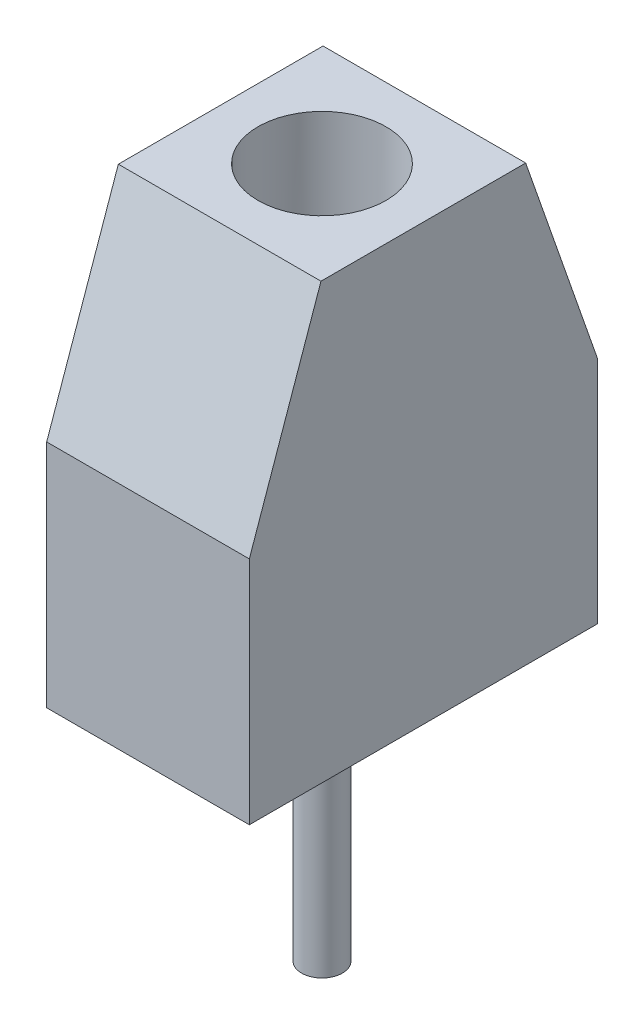
ISO-10303-21;
HEADER;
FILE_DESCRIPTION(('STEP AP214'),'2;1');
FILE_NAME('part.step','',(''),(''),'','','');
FILE_SCHEMA(('AUTOMOTIVE_DESIGN { 1 0 10303 214 1 1 1 1 }'));
ENDSEC;
DATA;
#1=APPLICATION_CONTEXT('core data for automotive mechanical design processes');
#2=APPLICATION_PROTOCOL_DEFINITION('international standard','automotive_design',2000,#1);
#3=PRODUCT_CONTEXT('',#1,'mechanical');
#4=PRODUCT('Part','Part','',(#3));
#5=PRODUCT_RELATED_PRODUCT_CATEGORY('part','',(#4));
#6=PRODUCT_DEFINITION_FORMATION('','',#4);
#7=PRODUCT_DEFINITION_CONTEXT('part definition',#1,'design');
#8=PRODUCT_DEFINITION('design','',#6,#7);
#9=PRODUCT_DEFINITION_SHAPE('','',#8);
#10=(LENGTH_UNIT() NAMED_UNIT(*) SI_UNIT(.MILLI.,.METRE.));
#11=(NAMED_UNIT(*) PLANE_ANGLE_UNIT() SI_UNIT($,.RADIAN.));
#12=(NAMED_UNIT(*) SI_UNIT($,.STERADIAN.) SOLID_ANGLE_UNIT());
#13=UNCERTAINTY_MEASURE_WITH_UNIT(LENGTH_MEASURE(1.E-05),#10,'distance_accuracy_value','');
#14=(GEOMETRIC_REPRESENTATION_CONTEXT(3) GLOBAL_UNCERTAINTY_ASSIGNED_CONTEXT((#13)) GLOBAL_UNIT_ASSIGNED_CONTEXT((#10,
#11,#12)) REPRESENTATION_CONTEXT('',''));
#15=CARTESIAN_POINT('',(0.,0.,0.));
#16=DIRECTION('',(0.,0.,1.));
#17=DIRECTION('',(1.,0.,0.));
#18=AXIS2_PLACEMENT_3D('',#15,#16,#17);
#19=CARTESIAN_POINT('',(3.96,0.,-3.40000000000001));
#20=DIRECTION('',(0.,1.,0.));
#21=DIRECTION('',(0.,0.,1.));
#22=AXIS2_PLACEMENT_3D('',#19,#20,#21);
#23=PLANE('',#22);
#24=DIRECTION('',(0.,0.,-1.));
#25=VECTOR('',#24,1.);
#26=CARTESIAN_POINT('',(0.,0.,-3.40000000000001));
#27=LINE('',#26,#25);
#28=CARTESIAN_POINT('',(0.,0.,3.39999999999999));
#29=VERTEX_POINT('',#28);
#30=CARTESIAN_POINT('',(0.,0.,-3.40000000000001));
#31=VERTEX_POINT('',#30);
#32=EDGE_CURVE('E134',#29,#31,#27,.T.);
#33=ORIENTED_EDGE('',*,*,#32,.T.);
#34=DIRECTION('',(-1.,0.,0.));
#35=VECTOR('',#34,1.);
#36=CARTESIAN_POINT('',(3.96,0.,-3.40000000000001));
#37=LINE('',#36,#35);
#38=CARTESIAN_POINT('',(3.96,0.,-3.40000000000001));
#39=VERTEX_POINT('',#38);
#40=EDGE_CURVE('E147',#39,#31,#37,.T.);
#41=ORIENTED_EDGE('',*,*,#40,.F.);
#42=DIRECTION('',(0.,0.,-1.));
#43=VECTOR('',#42,1.);
#44=CARTESIAN_POINT('',(3.96,0.,-3.40000000000001));
#45=LINE('',#44,#43);
#46=CARTESIAN_POINT('',(3.96,0.,3.39999999999999));
#47=VERTEX_POINT('',#46);
#48=EDGE_CURVE('E93',#47,#39,#45,.T.);
#49=ORIENTED_EDGE('',*,*,#48,.F.);
#50=DIRECTION('',(-1.,0.,0.));
#51=VECTOR('',#50,1.);
#52=CARTESIAN_POINT('',(3.96,0.,3.39999999999999));
#53=LINE('',#52,#51);
#54=EDGE_CURVE('E41',#47,#29,#53,.T.);
#55=ORIENTED_EDGE('',*,*,#54,.T.);
#56=EDGE_LOOP('',(#33,#41,#49,#55));
#57=FACE_BOUND('',#56,.T.);
#58=CARTESIAN_POINT('',(1.98,0.,0.));
#59=DIRECTION('',(0.,1.,0.));
#60=DIRECTION('',(0.,0.,1.));
#61=AXIS2_PLACEMENT_3D('',#58,#59,#60);
#62=CIRCLE('',#61,0.4);
#63=CARTESIAN_POINT('',(1.98,0.,0.4));
#64=VERTEX_POINT('',#63);
#65=EDGE_CURVE('E11',#64,#64,#62,.F.);
#66=ORIENTED_EDGE('',*,*,#65,.F.);
#67=EDGE_LOOP('',(#66));
#68=FACE_BOUND('',#67,.T.);
#69=ADVANCED_FACE('F33',(#57,#68),#23,.F.);
#70=CARTESIAN_POINT('',(1.98,6.5,0.));
#71=DIRECTION('',(0.,1.,0.));
#72=DIRECTION('',(0.,0.,1.));
#73=AXIS2_PLACEMENT_3D('',#70,#71,#72);
#74=PLANE('',#73);
#75=DIRECTION('',(1.,0.,0.));
#76=VECTOR('',#75,1.);
#77=CARTESIAN_POINT('',(0.755255128608411,6.5,0.25));
#78=LINE('',#77,#76);
#79=CARTESIAN_POINT('',(0.755255128608411,6.5,0.25));
#80=VERTEX_POINT('',#79);
#81=CARTESIAN_POINT('',(3.20474487139159,6.5,0.25));
#82=VERTEX_POINT('',#81);
#83=EDGE_CURVE('E163',#80,#82,#78,.T.);
#84=ORIENTED_EDGE('',*,*,#83,.F.);
#85=CARTESIAN_POINT('',(1.98,6.5,0.));
#86=DIRECTION('',(0.,1.,0.));
#87=DIRECTION('',(0.,0.,1.));
#88=AXIS2_PLACEMENT_3D('',#85,#86,#87);
#89=CIRCLE('',#88,1.25);
#90=EDGE_CURVE('E155',#80,#82,#89,.T.);
#91=ORIENTED_EDGE('',*,*,#90,.T.);
#92=EDGE_LOOP('',(#84,#91));
#93=FACE_BOUND('',#92,.T.);
#94=ADVANCED_FACE('F186',(#93),#74,.T.);
#95=CARTESIAN_POINT('',(3.96,0.,3.39999999999999));
#96=DIRECTION('',(0.,0.,-1.));
#97=DIRECTION('',(0.,1.,0.));
#98=AXIS2_PLACEMENT_3D('',#95,#96,#97);
#99=PLANE('',#98);
#100=DIRECTION('',(0.,-1.,0.));
#101=VECTOR('',#100,1.);
#102=CARTESIAN_POINT('',(0.,0.,3.39999999999999));
#103=LINE('',#102,#101);
#104=CARTESIAN_POINT('',(0.,4.5,3.39999999999999));
#105=VERTEX_POINT('',#104);
#106=EDGE_CURVE('E131',#105,#29,#103,.T.);
#107=ORIENTED_EDGE('',*,*,#106,.T.);
#108=ORIENTED_EDGE('',*,*,#54,.F.);
#109=DIRECTION('',(0.,-1.,0.));
#110=VECTOR('',#109,1.);
#111=CARTESIAN_POINT('',(3.96,0.,3.39999999999999));
#112=LINE('',#111,#110);
#113=CARTESIAN_POINT('',(3.96,4.5,3.39999999999999));
#114=VERTEX_POINT('',#113);
#115=EDGE_CURVE('E143',#114,#47,#112,.T.);
#116=ORIENTED_EDGE('',*,*,#115,.F.);
#117=DIRECTION('',(-1.,0.,0.));
#118=VECTOR('',#117,1.);
#119=CARTESIAN_POINT('',(3.96,4.5,3.39999999999999));
#120=LINE('',#119,#118);
#121=EDGE_CURVE('E127',#114,#105,#120,.T.);
#122=ORIENTED_EDGE('',*,*,#121,.T.);
#123=EDGE_LOOP('',(#107,#108,#116,#122));
#124=FACE_BOUND('',#123,.T.);
#125=ADVANCED_FACE('F35',(#124),#99,.F.);
#126=CARTESIAN_POINT('',(3.96,0.,-3.40000000000001));
#127=DIRECTION('',(0.,0.,1.));
#128=DIRECTION('',(0.,-1.,0.));
#129=AXIS2_PLACEMENT_3D('',#126,#127,#128);
#130=PLANE('',#129);
#131=DIRECTION('',(0.,1.,0.));
#132=VECTOR('',#131,1.);
#133=CARTESIAN_POINT('',(0.,0.,-3.40000000000001));
#134=LINE('',#133,#132);
#135=CARTESIAN_POINT('',(0.,4.5,-3.40000000000001));
#136=VERTEX_POINT('',#135);
#137=EDGE_CURVE('E137',#31,#136,#134,.T.);
#138=ORIENTED_EDGE('',*,*,#137,.T.);
#139=DIRECTION('',(-1.,0.,0.));
#140=VECTOR('',#139,1.);
#141=CARTESIAN_POINT('',(3.96,4.5,-3.40000000000001));
#142=LINE('',#141,#140);
#143=CARTESIAN_POINT('',(3.96,4.5,-3.40000000000001));
#144=VERTEX_POINT('',#143);
#145=EDGE_CURVE('E122',#144,#136,#142,.T.);
#146=ORIENTED_EDGE('',*,*,#145,.F.);
#147=DIRECTION('',(0.,1.,0.));
#148=VECTOR('',#147,1.);
#149=CARTESIAN_POINT('',(3.96,0.,-3.40000000000001));
#150=LINE('',#149,#148);
#151=EDGE_CURVE('E110',#39,#144,#150,.T.);
#152=ORIENTED_EDGE('',*,*,#151,.F.);
#153=ORIENTED_EDGE('',*,*,#40,.T.);
#154=EDGE_LOOP('',(#138,#146,#152,#153));
#155=FACE_BOUND('',#154,.T.);
#156=ADVANCED_FACE('F179',(#155),#130,.F.);
#157=CARTESIAN_POINT('',(3.96,4.5,-3.40000000000001));
#158=DIRECTION('',(0.,-0.330350424728106,0.943858356366018));
#159=DIRECTION('',(0.,-0.943858356366018,-0.330350424728106));
#160=AXIS2_PLACEMENT_3D('',#157,#158,#159);
#161=PLANE('',#160);
#162=DIRECTION('',(0.,0.943858356366017,0.330350424728106));
#163=VECTOR('',#162,1.);
#164=CARTESIAN_POINT('',(0.,4.5,-3.40000000000001));
#165=LINE('',#164,#163);
#166=CARTESIAN_POINT('',(0.,8.5,-2.00000000000001));
#167=VERTEX_POINT('',#166);
#168=EDGE_CURVE('E119',#136,#167,#165,.T.);
#169=ORIENTED_EDGE('',*,*,#168,.T.);
#170=DIRECTION('',(-1.,0.,0.));
#171=VECTOR('',#170,1.);
#172=CARTESIAN_POINT('',(3.96,8.5,-2.00000000000001));
#173=LINE('',#172,#171);
#174=CARTESIAN_POINT('',(3.96,8.5,-2.00000000000001));
#175=VERTEX_POINT('',#174);
#176=EDGE_CURVE('E116',#175,#167,#173,.T.);
#177=ORIENTED_EDGE('',*,*,#176,.F.);
#178=DIRECTION('',(0.,0.943858356366017,0.330350424728106));
#179=VECTOR('',#178,1.);
#180=CARTESIAN_POINT('',(3.96,4.5,-3.40000000000001));
#181=LINE('',#180,#179);
#182=EDGE_CURVE('E103',#144,#175,#181,.T.);
#183=ORIENTED_EDGE('',*,*,#182,.F.);
#184=ORIENTED_EDGE('',*,*,#145,.T.);
#185=EDGE_LOOP('',(#169,#177,#183,#184));
#186=FACE_BOUND('',#185,.T.);
#187=ADVANCED_FACE('F117',(#186),#161,.F.);
#188=CARTESIAN_POINT('',(3.96,8.5,1.99999999999999));
#189=DIRECTION('',(0.,-1.,0.));
#190=DIRECTION('',(0.,0.,-1.));
#191=AXIS2_PLACEMENT_3D('',#188,#189,#190);
#192=PLANE('',#191);
#193=CARTESIAN_POINT('',(1.98,8.5,0.));
#194=DIRECTION('',(0.,1.,0.));
#195=DIRECTION('',(0.,0.,1.));
#196=AXIS2_PLACEMENT_3D('',#193,#194,#195);
#197=CIRCLE('',#196,1.25);
#198=CARTESIAN_POINT('',(1.98,8.5,1.25));
#199=VERTEX_POINT('',#198);
#200=EDGE_CURVE('E158',#199,#199,#197,.T.);
#201=ORIENTED_EDGE('',*,*,#200,.F.);
#202=EDGE_LOOP('',(#201));
#203=FACE_BOUND('',#202,.T.);
#204=DIRECTION('',(0.,0.,1.));
#205=VECTOR('',#204,1.);
#206=CARTESIAN_POINT('',(0.,8.5,1.99999999999999));
#207=LINE('',#206,#205);
#208=CARTESIAN_POINT('',(0.,8.5,1.99999999999999));
#209=VERTEX_POINT('',#208);
#210=EDGE_CURVE('E140',#167,#209,#207,.T.);
#211=ORIENTED_EDGE('',*,*,#210,.T.);
#212=DIRECTION('',(-1.,0.,0.));
#213=VECTOR('',#212,1.);
#214=CARTESIAN_POINT('',(3.96,8.5,1.99999999999999));
#215=LINE('',#214,#213);
#216=CARTESIAN_POINT('',(3.96,8.5,1.99999999999999));
#217=VERTEX_POINT('',#216);
#218=EDGE_CURVE('E123',#217,#209,#215,.T.);
#219=ORIENTED_EDGE('',*,*,#218,.F.);
#220=DIRECTION('',(0.,0.,1.));
#221=VECTOR('',#220,1.);
#222=CARTESIAN_POINT('',(3.96,8.5,1.99999999999999));
#223=LINE('',#222,#221);
#224=EDGE_CURVE('E107',#175,#217,#223,.T.);
#225=ORIENTED_EDGE('',*,*,#224,.F.);
#226=ORIENTED_EDGE('',*,*,#176,.T.);
#227=EDGE_LOOP('',(#211,#219,#225,#226));
#228=FACE_BOUND('',#227,.T.);
#229=ADVANCED_FACE('F125',(#203,#228),#192,.F.);
#230=CARTESIAN_POINT('',(3.96,4.5,3.39999999999999));
#231=DIRECTION('',(0.,-0.330350424728106,-0.943858356366018));
#232=DIRECTION('',(0.,0.943858356366018,-0.330350424728106));
#233=AXIS2_PLACEMENT_3D('',#230,#231,#232);
#234=PLANE('',#233);
#235=DIRECTION('',(0.,-0.943858356366017,0.330350424728106));
#236=VECTOR('',#235,1.);
#237=CARTESIAN_POINT('',(0.,4.5,3.39999999999999));
#238=LINE('',#237,#236);
#239=EDGE_CURVE('E84',#209,#105,#238,.T.);
#240=ORIENTED_EDGE('',*,*,#239,.T.);
#241=ORIENTED_EDGE('',*,*,#121,.F.);
#242=DIRECTION('',(0.,-0.943858356366017,0.330350424728106));
#243=VECTOR('',#242,1.);
#244=CARTESIAN_POINT('',(3.96,4.5,3.39999999999999));
#245=LINE('',#244,#243);
#246=EDGE_CURVE('E57',#217,#114,#245,.T.);
#247=ORIENTED_EDGE('',*,*,#246,.F.);
#248=ORIENTED_EDGE('',*,*,#218,.T.);
#249=EDGE_LOOP('',(#240,#241,#247,#248));
#250=FACE_BOUND('',#249,.T.);
#251=ADVANCED_FACE('F183',(#250),#234,.F.);
#252=CARTESIAN_POINT('',(3.96,0.,0.));
#253=DIRECTION('',(-1.,0.,0.));
#254=DIRECTION('',(0.,0.,1.));
#255=AXIS2_PLACEMENT_3D('',#252,#253,#254);
#256=PLANE('',#255);
#257=ORIENTED_EDGE('',*,*,#115,.T.);
#258=ORIENTED_EDGE('',*,*,#48,.T.);
#259=ORIENTED_EDGE('',*,*,#151,.T.);
#260=ORIENTED_EDGE('',*,*,#182,.T.);
#261=ORIENTED_EDGE('',*,*,#224,.T.);
#262=ORIENTED_EDGE('',*,*,#246,.T.);
#263=EDGE_LOOP('',(#257,#258,#259,#260,#261,#262));
#264=FACE_BOUND('',#263,.T.);
#265=ADVANCED_FACE('F105',(#264),#256,.F.);
#266=CARTESIAN_POINT('',(0.,0.,0.));
#267=DIRECTION('',(-1.,0.,0.));
#268=DIRECTION('',(0.,0.,1.));
#269=AXIS2_PLACEMENT_3D('',#266,#267,#268);
#270=PLANE('',#269);
#271=ORIENTED_EDGE('',*,*,#106,.F.);
#272=ORIENTED_EDGE('',*,*,#239,.F.);
#273=ORIENTED_EDGE('',*,*,#210,.F.);
#274=ORIENTED_EDGE('',*,*,#168,.F.);
#275=ORIENTED_EDGE('',*,*,#137,.F.);
#276=ORIENTED_EDGE('',*,*,#32,.F.);
#277=EDGE_LOOP('',(#271,#272,#273,#274,#275,#276));
#278=FACE_BOUND('',#277,.T.);
#279=ADVANCED_FACE('F182',(#278),#270,.T.);
#280=CARTESIAN_POINT('',(1.98,6.5,0.));
#281=DIRECTION('',(0.,1.,0.));
#282=DIRECTION('',(0.,0.,1.));
#283=AXIS2_PLACEMENT_3D('',#280,#281,#282);
#284=CYLINDRICAL_SURFACE('',#283,1.25);
#285=CARTESIAN_POINT('',(3.20474487139159,6.5,-0.25));
#286=VERTEX_POINT('',#285);
#287=CARTESIAN_POINT('',(0.755255128608411,6.5,-0.25));
#288=VERTEX_POINT('',#287);
#289=EDGE_CURVE('E135',#286,#288,#89,.T.);
#290=ORIENTED_EDGE('',*,*,#289,.F.);
#291=DIRECTION('',(0.,1.,0.));
#292=VECTOR('',#291,1.);
#293=CARTESIAN_POINT('',(3.20474487139159,6.,-0.25));
#294=LINE('',#293,#292);
#295=CARTESIAN_POINT('',(3.20474487139159,6.,-0.25));
#296=VERTEX_POINT('',#295);
#297=EDGE_CURVE('E48',#296,#286,#294,.T.);
#298=ORIENTED_EDGE('',*,*,#297,.F.);
#299=CARTESIAN_POINT('',(1.98,6.,0.));
#300=DIRECTION('',(0.,1.,0.));
#301=DIRECTION('',(0.,0.,1.));
#302=AXIS2_PLACEMENT_3D('',#299,#300,#301);
#303=CIRCLE('',#302,1.25);
#304=CARTESIAN_POINT('',(3.20474487139159,6.,0.25));
#305=VERTEX_POINT('',#304);
#306=EDGE_CURVE('E250',#305,#296,#303,.T.);
#307=ORIENTED_EDGE('',*,*,#306,.F.);
#308=DIRECTION('',(0.,1.,0.));
#309=VECTOR('',#308,1.);
#310=CARTESIAN_POINT('',(3.20474487139159,6.,0.25));
#311=LINE('',#310,#309);
#312=EDGE_CURVE('E256',#305,#82,#311,.T.);
#313=ORIENTED_EDGE('',*,*,#312,.T.);
#314=ORIENTED_EDGE('',*,*,#90,.F.);
#315=DIRECTION('',(0.,1.,0.));
#316=VECTOR('',#315,1.);
#317=CARTESIAN_POINT('',(0.755255128608411,6.,0.25));
#318=LINE('',#317,#316);
#319=CARTESIAN_POINT('',(0.755255128608411,6.,0.25));
#320=VERTEX_POINT('',#319);
#321=EDGE_CURVE('E254',#320,#80,#318,.T.);
#322=ORIENTED_EDGE('',*,*,#321,.F.);
#323=CARTESIAN_POINT('',(1.98,6.,0.));
#324=DIRECTION('',(0.,1.,0.));
#325=DIRECTION('',(0.,0.,1.));
#326=AXIS2_PLACEMENT_3D('',#323,#324,#325);
#327=CIRCLE('',#326,1.25);
#328=CARTESIAN_POINT('',(0.755255128608411,6.,-0.25));
#329=VERTEX_POINT('',#328);
#330=EDGE_CURVE('E162',#329,#320,#327,.T.);
#331=ORIENTED_EDGE('',*,*,#330,.F.);
#332=DIRECTION('',(0.,1.,0.));
#333=VECTOR('',#332,1.);
#334=CARTESIAN_POINT('',(0.755255128608411,6.,-0.25));
#335=LINE('',#334,#333);
#336=EDGE_CURVE('E172',#329,#288,#335,.T.);
#337=ORIENTED_EDGE('',*,*,#336,.T.);
#338=EDGE_LOOP('',(#290,#298,#307,#313,#314,#322,#331,#337));
#339=FACE_BOUND('',#338,.T.);
#340=ORIENTED_EDGE('',*,*,#200,.T.);
#341=EDGE_LOOP('',(#340));
#342=FACE_BOUND('',#341,.T.);
#343=ADVANCED_FACE('F210',(#339,#342),#284,.F.);
#344=DIRECTION('',(-1.,0.,0.));
#345=VECTOR('',#344,1.);
#346=CARTESIAN_POINT('',(0.755255128608411,6.5,-0.25));
#347=LINE('',#346,#345);
#348=EDGE_CURVE('E159',#286,#288,#347,.T.);
#349=ORIENTED_EDGE('',*,*,#348,.F.);
#350=ORIENTED_EDGE('',*,*,#289,.T.);
#351=EDGE_LOOP('',(#349,#350));
#352=FACE_BOUND('',#351,.T.);
#353=ADVANCED_FACE('F194',(#352),#74,.T.);
#354=CARTESIAN_POINT('',(0.755255128608411,6.,-0.25));
#355=DIRECTION('',(0.,0.,-1.));
#356=DIRECTION('',(-1.,0.,0.));
#357=AXIS2_PLACEMENT_3D('',#354,#355,#356);
#358=PLANE('',#357);
#359=ORIENTED_EDGE('',*,*,#348,.T.);
#360=ORIENTED_EDGE('',*,*,#336,.F.);
#361=DIRECTION('',(-1.,0.,0.));
#362=VECTOR('',#361,1.);
#363=CARTESIAN_POINT('',(0.755255128608411,6.,-0.25));
#364=LINE('',#363,#362);
#365=EDGE_CURVE('E252',#296,#329,#364,.T.);
#366=ORIENTED_EDGE('',*,*,#365,.F.);
#367=ORIENTED_EDGE('',*,*,#297,.T.);
#368=EDGE_LOOP('',(#359,#360,#366,#367));
#369=FACE_BOUND('',#368,.T.);
#370=ADVANCED_FACE('F217',(#369),#358,.F.);
#371=CARTESIAN_POINT('',(0.755255128608411,6.,0.25));
#372=DIRECTION('',(0.,0.,1.));
#373=DIRECTION('',(1.,0.,0.));
#374=AXIS2_PLACEMENT_3D('',#371,#372,#373);
#375=PLANE('',#374);
#376=ORIENTED_EDGE('',*,*,#83,.T.);
#377=ORIENTED_EDGE('',*,*,#312,.F.);
#378=DIRECTION('',(1.,0.,0.));
#379=VECTOR('',#378,1.);
#380=CARTESIAN_POINT('',(0.755255128608411,6.,0.25));
#381=LINE('',#380,#379);
#382=EDGE_CURVE('E247',#320,#305,#381,.T.);
#383=ORIENTED_EDGE('',*,*,#382,.F.);
#384=ORIENTED_EDGE('',*,*,#321,.T.);
#385=EDGE_LOOP('',(#376,#377,#383,#384));
#386=FACE_BOUND('',#385,.T.);
#387=ADVANCED_FACE('F219',(#386),#375,.F.);
#388=CARTESIAN_POINT('',(1.98,6.,0.));
#389=DIRECTION('',(0.,1.,0.));
#390=DIRECTION('',(0.,0.,1.));
#391=AXIS2_PLACEMENT_3D('',#388,#389,#390);
#392=PLANE('',#391);
#393=ORIENTED_EDGE('',*,*,#330,.T.);
#394=ORIENTED_EDGE('',*,*,#382,.T.);
#395=ORIENTED_EDGE('',*,*,#306,.T.);
#396=ORIENTED_EDGE('',*,*,#365,.T.);
#397=EDGE_LOOP('',(#393,#394,#395,#396));
#398=FACE_BOUND('',#397,.T.);
#399=ADVANCED_FACE('F222',(#398),#392,.T.);
#400=CARTESIAN_POINT('',(1.98,-5.,0.));
#401=DIRECTION('',(0.,1.,0.));
#402=DIRECTION('',(0.,0.,1.));
#403=AXIS2_PLACEMENT_3D('',#400,#401,#402);
#404=CYLINDRICAL_SURFACE('',#403,0.4);
#405=CARTESIAN_POINT('',(1.98,-5.,0.));
#406=DIRECTION('',(0.,-1.,0.));
#407=DIRECTION('',(0.,0.,-1.));
#408=AXIS2_PLACEMENT_3D('',#405,#406,#407);
#409=CIRCLE('',#408,0.4);
#410=CARTESIAN_POINT('',(1.98,-5.,-0.4));
#411=VERTEX_POINT('',#410);
#412=EDGE_CURVE('E240',#411,#411,#409,.T.);
#413=ORIENTED_EDGE('',*,*,#412,.F.);
#414=EDGE_LOOP('',(#413));
#415=FACE_BOUND('',#414,.T.);
#416=ORIENTED_EDGE('',*,*,#65,.T.);
#417=EDGE_LOOP('',(#416));
#418=FACE_BOUND('',#417,.T.);
#419=ADVANCED_FACE('F228',(#415,#418),#404,.T.);
#420=CARTESIAN_POINT('',(1.98,-5.,0.));
#421=DIRECTION('',(0.,-1.,0.));
#422=DIRECTION('',(0.,0.,-1.));
#423=AXIS2_PLACEMENT_3D('',#420,#421,#422);
#424=PLANE('',#423);
#425=ORIENTED_EDGE('',*,*,#412,.T.);
#426=EDGE_LOOP('',(#425));
#427=FACE_BOUND('',#426,.T.);
#428=ADVANCED_FACE('F232',(#427),#424,.T.);
#429=CLOSED_SHELL('',(#69,#94,#125,#156,#187,#229,#251,#265,#279,#343,#353,#370,#387,#399,#419,#428));
#430=MANIFOLD_SOLID_BREP('B2',#429);
#431=ADVANCED_BREP_SHAPE_REPRESENTATION('',(#18,#430),#14);
#432=SHAPE_DEFINITION_REPRESENTATION(#9,#431);
ENDSEC;
END-ISO-10303-21;
